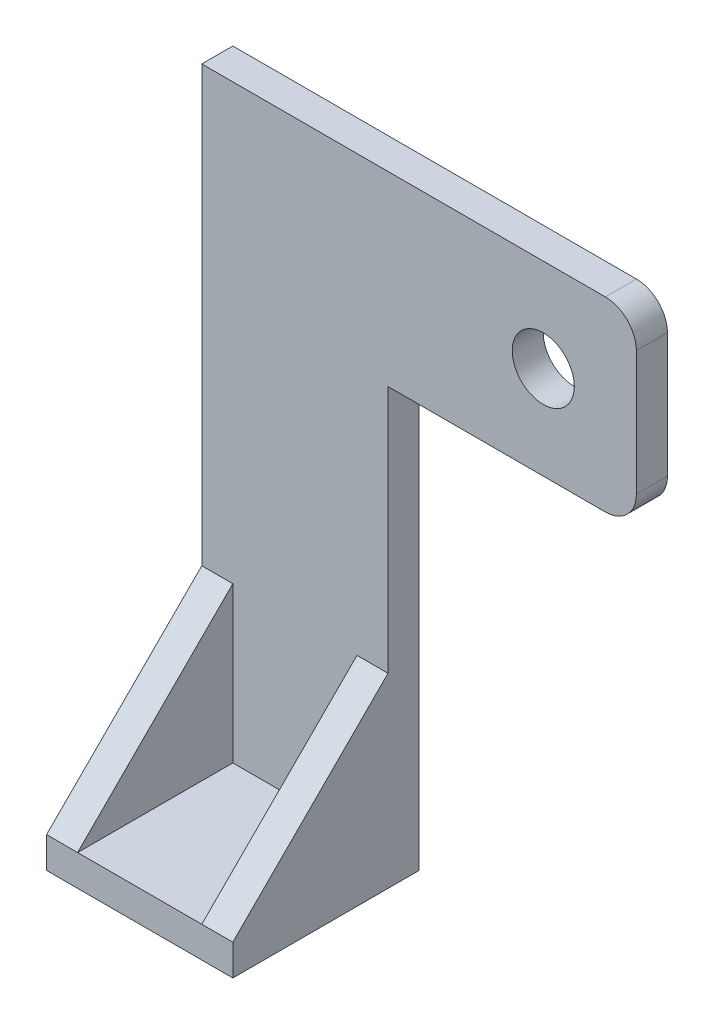
ISO-10303-21;
HEADER;
FILE_DESCRIPTION(('STEP AP214'),'2;1');
FILE_NAME('part.step','',(''),(''),'','','');
FILE_SCHEMA(('AUTOMOTIVE_DESIGN { 1 0 10303 214 1 1 1 1 }'));
ENDSEC;
DATA;
#1=APPLICATION_CONTEXT('core data for automotive mechanical design processes');
#2=APPLICATION_PROTOCOL_DEFINITION('international standard','automotive_design',2000,#1);
#3=PRODUCT_CONTEXT('',#1,'mechanical');
#4=PRODUCT('Part','Part','',(#3));
#5=PRODUCT_RELATED_PRODUCT_CATEGORY('part','',(#4));
#6=PRODUCT_DEFINITION_FORMATION('','',#4);
#7=PRODUCT_DEFINITION_CONTEXT('part definition',#1,'design');
#8=PRODUCT_DEFINITION('design','',#6,#7);
#9=PRODUCT_DEFINITION_SHAPE('','',#8);
#10=(LENGTH_UNIT() NAMED_UNIT(*) SI_UNIT(.MILLI.,.METRE.));
#11=(NAMED_UNIT(*) PLANE_ANGLE_UNIT() SI_UNIT($,.RADIAN.));
#12=(NAMED_UNIT(*) SI_UNIT($,.STERADIAN.) SOLID_ANGLE_UNIT());
#13=UNCERTAINTY_MEASURE_WITH_UNIT(LENGTH_MEASURE(1.E-05),#10,'distance_accuracy_value','');
#14=(GEOMETRIC_REPRESENTATION_CONTEXT(3) GLOBAL_UNCERTAINTY_ASSIGNED_CONTEXT((#13)) GLOBAL_UNIT_ASSIGNED_CONTEXT((#10,
#11,#12)) REPRESENTATION_CONTEXT('',''));
#15=CARTESIAN_POINT('',(0.,0.,0.));
#16=DIRECTION('',(0.,0.,1.));
#17=DIRECTION('',(1.,0.,0.));
#18=AXIS2_PLACEMENT_3D('',#15,#16,#17);
#19=CARTESIAN_POINT('',(0.,-95.,0.));
#20=DIRECTION('',(0.,1.,0.));
#21=DIRECTION('',(0.,0.,1.));
#22=AXIS2_PLACEMENT_3D('',#19,#20,#21);
#23=PLANE('',#22);
#24=DIRECTION('',(-1.,0.,0.));
#25=VECTOR('',#24,1.);
#26=CARTESIAN_POINT('',(40.,-95.,30.));
#27=LINE('',#26,#25);
#28=CARTESIAN_POINT('',(65.,-95.,30.));
#29=VERTEX_POINT('',#28);
#30=CARTESIAN_POINT('',(45.,-95.,30.));
#31=VERTEX_POINT('',#30);
#32=EDGE_CURVE('E214',#29,#31,#27,.T.);
#33=ORIENTED_EDGE('',*,*,#32,.F.);
#34=DIRECTION('',(0.,0.,1.));
#35=VECTOR('',#34,1.);
#36=CARTESIAN_POINT('',(65.,-95.,30.));
#37=LINE('',#36,#35);
#38=CARTESIAN_POINT('',(65.,-95.,5.));
#39=VERTEX_POINT('',#38);
#40=EDGE_CURVE('E193',#39,#29,#37,.T.);
#41=ORIENTED_EDGE('',*,*,#40,.F.);
#42=DIRECTION('',(-1.,0.,0.));
#43=VECTOR('',#42,1.);
#44=CARTESIAN_POINT('',(70.,-95.,5.));
#45=LINE('',#44,#43);
#46=CARTESIAN_POINT('',(45.,-95.,5.));
#47=VERTEX_POINT('',#46);
#48=EDGE_CURVE('E141',#39,#47,#45,.T.);
#49=ORIENTED_EDGE('',*,*,#48,.T.);
#50=DIRECTION('',(0.,0.,1.));
#51=VECTOR('',#50,1.);
#52=CARTESIAN_POINT('',(45.,-95.,30.));
#53=LINE('',#52,#51);
#54=EDGE_CURVE('E204',#47,#31,#53,.T.);
#55=ORIENTED_EDGE('',*,*,#54,.T.);
#56=EDGE_LOOP('',(#33,#41,#49,#55));
#57=FACE_BOUND('',#56,.T.);
#58=ADVANCED_FACE('F36',(#57),#23,.T.);
#59=CARTESIAN_POINT('',(5.,-5.,5.));
#60=DIRECTION('',(0.,0.,1.));
#61=DIRECTION('',(1.,0.,0.));
#62=AXIS2_PLACEMENT_3D('',#59,#60,#61);
#63=PLANE('',#62);
#64=DIRECTION('',(1.,0.,0.));
#65=VECTOR('',#64,1.);
#66=CARTESIAN_POINT('',(5.,0.,5.));
#67=LINE('',#66,#65);
#68=CARTESIAN_POINT('',(40.,0.,5.));
#69=VERTEX_POINT('',#68);
#70=CARTESIAN_POINT('',(105.,0.,5.));
#71=VERTEX_POINT('',#70);
#72=EDGE_CURVE('E11',#69,#71,#67,.T.);
#73=ORIENTED_EDGE('',*,*,#72,.F.);
#74=DIRECTION('',(0.,-1.,0.));
#75=VECTOR('',#74,1.);
#76=CARTESIAN_POINT('',(40.,-30.,5.));
#77=LINE('',#76,#75);
#78=CARTESIAN_POINT('',(40.,-70.,5.));
#79=VERTEX_POINT('',#78);
#80=EDGE_CURVE('E132',#69,#79,#77,.T.);
#81=ORIENTED_EDGE('',*,*,#80,.T.);
#82=DIRECTION('',(-1.,0.,0.));
#83=VECTOR('',#82,1.);
#84=CARTESIAN_POINT('',(45.,-70.,5.));
#85=LINE('',#84,#83);
#86=CARTESIAN_POINT('',(45.,-70.,5.));
#87=VERTEX_POINT('',#86);
#88=EDGE_CURVE('E212',#87,#79,#85,.T.);
#89=ORIENTED_EDGE('',*,*,#88,.F.);
#90=DIRECTION('',(0.,-1.,0.));
#91=VECTOR('',#90,1.);
#92=CARTESIAN_POINT('',(45.,-95.,5.));
#93=LINE('',#92,#91);
#94=EDGE_CURVE('E201',#87,#47,#93,.T.);
#95=ORIENTED_EDGE('',*,*,#94,.T.);
#96=ORIENTED_EDGE('',*,*,#48,.F.);
#97=DIRECTION('',(0.,-1.,0.));
#98=VECTOR('',#97,1.);
#99=CARTESIAN_POINT('',(65.,-95.,5.));
#100=LINE('',#99,#98);
#101=CARTESIAN_POINT('',(65.,-70.,5.));
#102=VERTEX_POINT('',#101);
#103=EDGE_CURVE('E189',#102,#39,#100,.T.);
#104=ORIENTED_EDGE('',*,*,#103,.F.);
#105=DIRECTION('',(1.,0.,0.));
#106=VECTOR('',#105,1.);
#107=CARTESIAN_POINT('',(65.,-70.,5.));
#108=LINE('',#107,#106);
#109=CARTESIAN_POINT('',(70.,-70.,5.));
#110=VERTEX_POINT('',#109);
#111=EDGE_CURVE('E196',#102,#110,#108,.T.);
#112=ORIENTED_EDGE('',*,*,#111,.T.);
#113=DIRECTION('',(0.,-1.,0.));
#114=VECTOR('',#113,1.);
#115=CARTESIAN_POINT('',(70.,-30.,5.));
#116=LINE('',#115,#114);
#117=CARTESIAN_POINT('',(70.,-30.,5.));
#118=VERTEX_POINT('',#117);
#119=EDGE_CURVE('E45',#118,#110,#116,.T.);
#120=ORIENTED_EDGE('',*,*,#119,.F.);
#121=DIRECTION('',(-1.,0.,0.));
#122=VECTOR('',#121,1.);
#123=CARTESIAN_POINT('',(105.,-30.,5.));
#124=LINE('',#123,#122);
#125=CARTESIAN_POINT('',(105.,-30.,5.));
#126=VERTEX_POINT('',#125);
#127=EDGE_CURVE('E158',#126,#118,#124,.T.);
#128=ORIENTED_EDGE('',*,*,#127,.F.);
#129=CARTESIAN_POINT('',(105.,-25.,5.));
#130=DIRECTION('',(0.,0.,1.));
#131=DIRECTION('',(1.,0.,0.));
#132=AXIS2_PLACEMENT_3D('',#129,#130,#131);
#133=CIRCLE('',#132,5.);
#134=CARTESIAN_POINT('',(110.,-25.,5.));
#135=VERTEX_POINT('',#134);
#136=EDGE_CURVE('E161',#126,#135,#133,.T.);
#137=ORIENTED_EDGE('',*,*,#136,.T.);
#138=DIRECTION('',(0.,-1.,0.));
#139=VECTOR('',#138,1.);
#140=CARTESIAN_POINT('',(110.,-5.00000000000001,5.));
#141=LINE('',#140,#139);
#142=CARTESIAN_POINT('',(110.,-5.00000000000001,5.));
#143=VERTEX_POINT('',#142);
#144=EDGE_CURVE('E156',#143,#135,#141,.T.);
#145=ORIENTED_EDGE('',*,*,#144,.F.);
#146=CARTESIAN_POINT('',(105.,-5.00000000000001,5.));
#147=DIRECTION('',(0.,0.,-1.));
#148=DIRECTION('',(-1.,0.,0.));
#149=AXIS2_PLACEMENT_3D('',#146,#147,#148);
#150=CIRCLE('',#149,5.);
#151=EDGE_CURVE('E154',#71,#143,#150,.T.);
#152=ORIENTED_EDGE('',*,*,#151,.F.);
#153=EDGE_LOOP('',(#73,#81,#89,#95,#96,#104,#112,#120,#128,#137,#145,#152));
#154=FACE_BOUND('',#153,.T.);
#155=CARTESIAN_POINT('',(95.,-15.,5.));
#156=DIRECTION('',(0.,0.,1.));
#157=DIRECTION('',(1.,0.,0.));
#158=AXIS2_PLACEMENT_3D('',#155,#156,#157);
#159=CIRCLE('',#158,5.);
#160=CARTESIAN_POINT('',(100.,-15.,5.));
#161=VERTEX_POINT('',#160);
#162=EDGE_CURVE('E147',#161,#161,#159,.T.);
#163=ORIENTED_EDGE('',*,*,#162,.F.);
#164=EDGE_LOOP('',(#163));
#165=FACE_BOUND('',#164,.T.);
#166=ADVANCED_FACE('F150',(#154,#165),#63,.T.);
#167=CARTESIAN_POINT('',(40.,-30.,5.));
#168=DIRECTION('',(1.,0.,0.));
#169=DIRECTION('',(0.,1.,0.));
#170=AXIS2_PLACEMENT_3D('',#167,#168,#169);
#171=PLANE('',#170);
#172=DIRECTION('',(0.,-1.,0.));
#173=VECTOR('',#172,1.);
#174=CARTESIAN_POINT('',(40.,-30.,0.));
#175=LINE('',#174,#173);
#176=CARTESIAN_POINT('',(40.,0.,0.));
#177=VERTEX_POINT('',#176);
#178=CARTESIAN_POINT('',(40.,-100.,0.));
#179=VERTEX_POINT('',#178);
#180=EDGE_CURVE('E53',#177,#179,#175,.T.);
#181=ORIENTED_EDGE('',*,*,#180,.T.);
#182=DIRECTION('',(0.,0.,-1.));
#183=VECTOR('',#182,1.);
#184=CARTESIAN_POINT('',(40.,-100.,0.));
#185=LINE('',#184,#183);
#186=CARTESIAN_POINT('',(40.,-100.,30.));
#187=VERTEX_POINT('',#186);
#188=EDGE_CURVE('E217',#187,#179,#185,.T.);
#189=ORIENTED_EDGE('',*,*,#188,.F.);
#190=DIRECTION('',(0.,1.,0.));
#191=VECTOR('',#190,1.);
#192=CARTESIAN_POINT('',(40.,-100.,30.));
#193=LINE('',#192,#191);
#194=CARTESIAN_POINT('',(40.,-95.,30.));
#195=VERTEX_POINT('',#194);
#196=EDGE_CURVE('E228',#187,#195,#193,.T.);
#197=ORIENTED_EDGE('',*,*,#196,.T.);
#198=DIRECTION('',(0.,0.707106781186547,-0.707106781186548));
#199=VECTOR('',#198,1.);
#200=CARTESIAN_POINT('',(40.,-70.,5.));
#201=LINE('',#200,#199);
#202=EDGE_CURVE('E137',#195,#79,#201,.T.);
#203=ORIENTED_EDGE('',*,*,#202,.T.);
#204=ORIENTED_EDGE('',*,*,#80,.F.);
#205=DIRECTION('',(0.,0.,-1.));
#206=VECTOR('',#205,1.);
#207=CARTESIAN_POINT('',(40.,0.,5.));
#208=LINE('',#207,#206);
#209=EDGE_CURVE('E134',#69,#177,#208,.T.);
#210=ORIENTED_EDGE('',*,*,#209,.T.);
#211=EDGE_LOOP('',(#181,#189,#197,#203,#204,#210));
#212=FACE_BOUND('',#211,.T.);
#213=ADVANCED_FACE('F38',(#212),#171,.F.);
#214=CARTESIAN_POINT('',(70.,0.,5.));
#215=DIRECTION('',(1.,0.,0.));
#216=DIRECTION('',(0.,0.,-1.));
#217=AXIS2_PLACEMENT_3D('',#214,#215,#216);
#218=PLANE('',#217);
#219=DIRECTION('',(0.,0.,-1.));
#220=VECTOR('',#219,1.);
#221=CARTESIAN_POINT('',(70.,-30.,5.));
#222=LINE('',#221,#220);
#223=CARTESIAN_POINT('',(70.,-30.,0.));
#224=VERTEX_POINT('',#223);
#225=EDGE_CURVE('E184',#118,#224,#222,.T.);
#226=ORIENTED_EDGE('',*,*,#225,.F.);
#227=ORIENTED_EDGE('',*,*,#119,.T.);
#228=DIRECTION('',(0.,0.707106781186547,-0.707106781186548));
#229=VECTOR('',#228,1.);
#230=CARTESIAN_POINT('',(70.,-70.,5.));
#231=LINE('',#230,#229);
#232=CARTESIAN_POINT('',(70.,-95.,30.));
#233=VERTEX_POINT('',#232);
#234=EDGE_CURVE('E188',#233,#110,#231,.T.);
#235=ORIENTED_EDGE('',*,*,#234,.F.);
#236=DIRECTION('',(0.,1.,0.));
#237=VECTOR('',#236,1.);
#238=CARTESIAN_POINT('',(70.,-100.,30.));
#239=LINE('',#238,#237);
#240=CARTESIAN_POINT('',(70.,-100.,30.));
#241=VERTEX_POINT('',#240);
#242=EDGE_CURVE('E232',#241,#233,#239,.T.);
#243=ORIENTED_EDGE('',*,*,#242,.F.);
#244=DIRECTION('',(0.,0.,1.));
#245=VECTOR('',#244,1.);
#246=CARTESIAN_POINT('',(70.,-100.,0.));
#247=LINE('',#246,#245);
#248=CARTESIAN_POINT('',(70.,-100.,0.));
#249=VERTEX_POINT('',#248);
#250=EDGE_CURVE('E224',#249,#241,#247,.T.);
#251=ORIENTED_EDGE('',*,*,#250,.F.);
#252=DIRECTION('',(0.,-1.,0.));
#253=VECTOR('',#252,1.);
#254=CARTESIAN_POINT('',(70.,0.,0.));
#255=LINE('',#254,#253);
#256=EDGE_CURVE('E237',#224,#249,#255,.T.);
#257=ORIENTED_EDGE('',*,*,#256,.F.);
#258=EDGE_LOOP('',(#226,#227,#235,#243,#251,#257));
#259=FACE_BOUND('',#258,.T.);
#260=ADVANCED_FACE('F255',(#259),#218,.T.);
#261=CARTESIAN_POINT('',(5.,0.,5.));
#262=DIRECTION('',(0.,1.,0.));
#263=DIRECTION('',(0.,0.,1.));
#264=AXIS2_PLACEMENT_3D('',#261,#262,#263);
#265=PLANE('',#264);
#266=ORIENTED_EDGE('',*,*,#209,.F.);
#267=ORIENTED_EDGE('',*,*,#72,.T.);
#268=DIRECTION('',(0.,0.,-1.));
#269=VECTOR('',#268,1.);
#270=CARTESIAN_POINT('',(105.,0.,5.));
#271=LINE('',#270,#269);
#272=CARTESIAN_POINT('',(105.,0.,0.));
#273=VERTEX_POINT('',#272);
#274=EDGE_CURVE('E186',#71,#273,#271,.T.);
#275=ORIENTED_EDGE('',*,*,#274,.T.);
#276=DIRECTION('',(1.,0.,0.));
#277=VECTOR('',#276,1.);
#278=CARTESIAN_POINT('',(5.,0.,0.));
#279=LINE('',#278,#277);
#280=EDGE_CURVE('E40',#177,#273,#279,.T.);
#281=ORIENTED_EDGE('',*,*,#280,.F.);
#282=EDGE_LOOP('',(#266,#267,#275,#281));
#283=FACE_BOUND('',#282,.T.);
#284=ADVANCED_FACE('F144',(#283),#265,.T.);
#285=CARTESIAN_POINT('',(5.,-5.,0.));
#286=DIRECTION('',(0.,0.,1.));
#287=DIRECTION('',(1.,0.,0.));
#288=AXIS2_PLACEMENT_3D('',#285,#286,#287);
#289=PLANE('',#288);
#290=CARTESIAN_POINT('',(95.,-15.,0.));
#291=DIRECTION('',(0.,0.,1.));
#292=DIRECTION('',(1.,0.,0.));
#293=AXIS2_PLACEMENT_3D('',#290,#291,#292);
#294=CIRCLE('',#293,5.);
#295=CARTESIAN_POINT('',(100.,-15.,0.));
#296=VERTEX_POINT('',#295);
#297=EDGE_CURVE('E175',#296,#296,#294,.T.);
#298=ORIENTED_EDGE('',*,*,#297,.T.);
#299=EDGE_LOOP('',(#298));
#300=FACE_BOUND('',#299,.T.);
#301=ORIENTED_EDGE('',*,*,#180,.F.);
#302=ORIENTED_EDGE('',*,*,#280,.T.);
#303=CARTESIAN_POINT('',(105.,-5.00000000000001,0.));
#304=DIRECTION('',(0.,0.,-1.));
#305=DIRECTION('',(-1.,0.,0.));
#306=AXIS2_PLACEMENT_3D('',#303,#304,#305);
#307=CIRCLE('',#306,5.);
#308=CARTESIAN_POINT('',(110.,-5.00000000000001,0.));
#309=VERTEX_POINT('',#308);
#310=EDGE_CURVE('E172',#273,#309,#307,.T.);
#311=ORIENTED_EDGE('',*,*,#310,.T.);
#312=DIRECTION('',(0.,-1.,0.));
#313=VECTOR('',#312,1.);
#314=CARTESIAN_POINT('',(110.,-5.00000000000001,0.));
#315=LINE('',#314,#313);
#316=CARTESIAN_POINT('',(110.,-25.,0.));
#317=VERTEX_POINT('',#316);
#318=EDGE_CURVE('E159',#309,#317,#315,.T.);
#319=ORIENTED_EDGE('',*,*,#318,.T.);
#320=CARTESIAN_POINT('',(105.,-25.,0.));
#321=DIRECTION('',(0.,0.,1.));
#322=DIRECTION('',(1.,0.,0.));
#323=AXIS2_PLACEMENT_3D('',#320,#321,#322);
#324=CIRCLE('',#323,5.);
#325=CARTESIAN_POINT('',(105.,-30.,0.));
#326=VERTEX_POINT('',#325);
#327=EDGE_CURVE('E164',#326,#317,#324,.T.);
#328=ORIENTED_EDGE('',*,*,#327,.F.);
#329=DIRECTION('',(-1.,0.,0.));
#330=VECTOR('',#329,1.);
#331=CARTESIAN_POINT('',(105.,-30.,0.));
#332=LINE('',#331,#330);
#333=EDGE_CURVE('E60',#326,#224,#332,.T.);
#334=ORIENTED_EDGE('',*,*,#333,.T.);
#335=ORIENTED_EDGE('',*,*,#256,.T.);
#336=DIRECTION('',(1.,0.,0.));
#337=VECTOR('',#336,1.);
#338=CARTESIAN_POINT('',(40.,-100.,0.));
#339=LINE('',#338,#337);
#340=EDGE_CURVE('E220',#179,#249,#339,.T.);
#341=ORIENTED_EDGE('',*,*,#340,.F.);
#342=EDGE_LOOP('',(#301,#302,#311,#319,#328,#334,#335,#341));
#343=FACE_BOUND('',#342,.T.);
#344=ADVANCED_FACE('F239',(#300,#343),#289,.F.);
#345=CARTESIAN_POINT('',(40.,-100.,30.));
#346=DIRECTION('',(0.,0.,-1.));
#347=DIRECTION('',(-1.,0.,0.));
#348=AXIS2_PLACEMENT_3D('',#345,#346,#347);
#349=PLANE('',#348);
#350=EDGE_CURVE('E221',#233,#29,#27,.T.);
#351=ORIENTED_EDGE('',*,*,#350,.T.);
#352=ORIENTED_EDGE('',*,*,#32,.T.);
#353=DIRECTION('',(-1.,0.,0.));
#354=VECTOR('',#353,1.);
#355=CARTESIAN_POINT('',(45.,-95.,30.));
#356=LINE('',#355,#354);
#357=EDGE_CURVE('E210',#31,#195,#356,.T.);
#358=ORIENTED_EDGE('',*,*,#357,.T.);
#359=ORIENTED_EDGE('',*,*,#196,.F.);
#360=DIRECTION('',(-1.,0.,0.));
#361=VECTOR('',#360,1.);
#362=CARTESIAN_POINT('',(40.,-100.,30.));
#363=LINE('',#362,#361);
#364=EDGE_CURVE('E226',#241,#187,#363,.T.);
#365=ORIENTED_EDGE('',*,*,#364,.F.);
#366=ORIENTED_EDGE('',*,*,#242,.T.);
#367=EDGE_LOOP('',(#351,#352,#358,#359,#365,#366));
#368=FACE_BOUND('',#367,.T.);
#369=ADVANCED_FACE('F264',(#368),#349,.F.);
#370=CARTESIAN_POINT('',(0.,-100.,0.));
#371=DIRECTION('',(0.,1.,0.));
#372=DIRECTION('',(0.,0.,1.));
#373=AXIS2_PLACEMENT_3D('',#370,#371,#372);
#374=PLANE('',#373);
#375=ORIENTED_EDGE('',*,*,#188,.T.);
#376=ORIENTED_EDGE('',*,*,#340,.T.);
#377=ORIENTED_EDGE('',*,*,#250,.T.);
#378=ORIENTED_EDGE('',*,*,#364,.T.);
#379=EDGE_LOOP('',(#375,#376,#377,#378));
#380=FACE_BOUND('',#379,.T.);
#381=ADVANCED_FACE('F260',(#380),#374,.F.);
#382=CARTESIAN_POINT('',(45.,-70.,5.));
#383=DIRECTION('',(0.,0.707106781186548,0.707106781186547));
#384=DIRECTION('',(0.,-0.707106781186547,0.707106781186548));
#385=AXIS2_PLACEMENT_3D('',#382,#383,#384);
#386=PLANE('',#385);
#387=ORIENTED_EDGE('',*,*,#202,.F.);
#388=ORIENTED_EDGE('',*,*,#357,.F.);
#389=DIRECTION('',(0.,0.707106781186547,-0.707106781186548));
#390=VECTOR('',#389,1.);
#391=CARTESIAN_POINT('',(45.,-70.,5.));
#392=LINE('',#391,#390);
#393=EDGE_CURVE('E207',#31,#87,#392,.T.);
#394=ORIENTED_EDGE('',*,*,#393,.T.);
#395=ORIENTED_EDGE('',*,*,#88,.T.);
#396=EDGE_LOOP('',(#387,#388,#394,#395));
#397=FACE_BOUND('',#396,.T.);
#398=ADVANCED_FACE('F269',(#397),#386,.T.);
#399=CARTESIAN_POINT('',(45.,0.,0.));
#400=DIRECTION('',(-1.,0.,0.));
#401=DIRECTION('',(0.,0.,1.));
#402=AXIS2_PLACEMENT_3D('',#399,#400,#401);
#403=PLANE('',#402);
#404=ORIENTED_EDGE('',*,*,#94,.F.);
#405=ORIENTED_EDGE('',*,*,#393,.F.);
#406=ORIENTED_EDGE('',*,*,#54,.F.);
#407=EDGE_LOOP('',(#404,#405,#406));
#408=FACE_BOUND('',#407,.T.);
#409=ADVANCED_FACE('F272',(#408),#403,.F.);
#410=CARTESIAN_POINT('',(65.,-70.,5.));
#411=DIRECTION('',(0.,-0.707106781186548,-0.707106781186547));
#412=DIRECTION('',(0.,0.707106781186547,-0.707106781186548));
#413=AXIS2_PLACEMENT_3D('',#410,#411,#412);
#414=PLANE('',#413);
#415=ORIENTED_EDGE('',*,*,#234,.T.);
#416=ORIENTED_EDGE('',*,*,#111,.F.);
#417=DIRECTION('',(0.,0.707106781186547,-0.707106781186548));
#418=VECTOR('',#417,1.);
#419=CARTESIAN_POINT('',(65.,-70.,5.));
#420=LINE('',#419,#418);
#421=EDGE_CURVE('E191',#29,#102,#420,.T.);
#422=ORIENTED_EDGE('',*,*,#421,.F.);
#423=ORIENTED_EDGE('',*,*,#350,.F.);
#424=EDGE_LOOP('',(#415,#416,#422,#423));
#425=FACE_BOUND('',#424,.T.);
#426=ADVANCED_FACE('F281',(#425),#414,.F.);
#427=CARTESIAN_POINT('',(65.,0.,0.));
#428=DIRECTION('',(1.,0.,0.));
#429=DIRECTION('',(0.,0.,1.));
#430=AXIS2_PLACEMENT_3D('',#427,#428,#429);
#431=PLANE('',#430);
#432=ORIENTED_EDGE('',*,*,#103,.T.);
#433=ORIENTED_EDGE('',*,*,#40,.T.);
#434=ORIENTED_EDGE('',*,*,#421,.T.);
#435=EDGE_LOOP('',(#432,#433,#434));
#436=FACE_BOUND('',#435,.T.);
#437=ADVANCED_FACE('F279',(#436),#431,.F.);
#438=CARTESIAN_POINT('',(105.,-5.00000000000001,5.));
#439=DIRECTION('',(0.,0.,-1.));
#440=DIRECTION('',(-1.,0.,0.));
#441=AXIS2_PLACEMENT_3D('',#438,#439,#440);
#442=CYLINDRICAL_SURFACE('',#441,5.);
#443=ORIENTED_EDGE('',*,*,#310,.F.);
#444=ORIENTED_EDGE('',*,*,#274,.F.);
#445=ORIENTED_EDGE('',*,*,#151,.T.);
#446=DIRECTION('',(0.,0.,-1.));
#447=VECTOR('',#446,1.);
#448=CARTESIAN_POINT('',(110.,-5.00000000000001,5.));
#449=LINE('',#448,#447);
#450=EDGE_CURVE('E171',#143,#309,#449,.T.);
#451=ORIENTED_EDGE('',*,*,#450,.T.);
#452=EDGE_LOOP('',(#443,#444,#445,#451));
#453=FACE_BOUND('',#452,.T.);
#454=ADVANCED_FACE('F242',(#453),#442,.T.);
#455=CARTESIAN_POINT('',(105.,-30.,5.));
#456=DIRECTION('',(0.,-1.,0.));
#457=DIRECTION('',(1.,0.,0.));
#458=AXIS2_PLACEMENT_3D('',#455,#456,#457);
#459=PLANE('',#458);
#460=ORIENTED_EDGE('',*,*,#333,.F.);
#461=DIRECTION('',(0.,0.,-1.));
#462=VECTOR('',#461,1.);
#463=CARTESIAN_POINT('',(105.,-30.,5.));
#464=LINE('',#463,#462);
#465=EDGE_CURVE('E182',#126,#326,#464,.T.);
#466=ORIENTED_EDGE('',*,*,#465,.F.);
#467=ORIENTED_EDGE('',*,*,#127,.T.);
#468=ORIENTED_EDGE('',*,*,#225,.T.);
#469=EDGE_LOOP('',(#460,#466,#467,#468));
#470=FACE_BOUND('',#469,.T.);
#471=ADVANCED_FACE('F248',(#470),#459,.T.);
#472=CARTESIAN_POINT('',(105.,-25.,5.));
#473=DIRECTION('',(0.,0.,-1.));
#474=DIRECTION('',(-1.,0.,0.));
#475=AXIS2_PLACEMENT_3D('',#472,#473,#474);
#476=CYLINDRICAL_SURFACE('',#475,5.);
#477=ORIENTED_EDGE('',*,*,#327,.T.);
#478=DIRECTION('',(0.,0.,-1.));
#479=VECTOR('',#478,1.);
#480=CARTESIAN_POINT('',(110.,-25.,5.));
#481=LINE('',#480,#479);
#482=EDGE_CURVE('E180',#135,#317,#481,.T.);
#483=ORIENTED_EDGE('',*,*,#482,.F.);
#484=ORIENTED_EDGE('',*,*,#136,.F.);
#485=ORIENTED_EDGE('',*,*,#465,.T.);
#486=EDGE_LOOP('',(#477,#483,#484,#485));
#487=FACE_BOUND('',#486,.T.);
#488=ADVANCED_FACE('F282',(#487),#476,.T.);
#489=CARTESIAN_POINT('',(110.,-5.00000000000001,5.));
#490=DIRECTION('',(1.,0.,0.));
#491=DIRECTION('',(0.,1.,0.));
#492=AXIS2_PLACEMENT_3D('',#489,#490,#491);
#493=PLANE('',#492);
#494=ORIENTED_EDGE('',*,*,#318,.F.);
#495=ORIENTED_EDGE('',*,*,#450,.F.);
#496=ORIENTED_EDGE('',*,*,#144,.T.);
#497=ORIENTED_EDGE('',*,*,#482,.T.);
#498=EDGE_LOOP('',(#494,#495,#496,#497));
#499=FACE_BOUND('',#498,.T.);
#500=ADVANCED_FACE('F244',(#499),#493,.T.);
#501=CARTESIAN_POINT('',(95.,-15.,0.));
#502=DIRECTION('',(0.,0.,1.));
#503=DIRECTION('',(1.,0.,0.));
#504=AXIS2_PLACEMENT_3D('',#501,#502,#503);
#505=CYLINDRICAL_SURFACE('',#504,5.);
#506=ORIENTED_EDGE('',*,*,#297,.F.);
#507=EDGE_LOOP('',(#506));
#508=FACE_BOUND('',#507,.T.);
#509=ORIENTED_EDGE('',*,*,#162,.T.);
#510=EDGE_LOOP('',(#509));
#511=FACE_BOUND('',#510,.T.);
#512=ADVANCED_FACE('F289',(#508,#511),#505,.F.);
#513=CLOSED_SHELL('',(#58,#166,#213,#260,#284,#344,#369,#381,#398,#409,#426,#437,#454,#471,#488,
#500,#512));
#514=MANIFOLD_SOLID_BREP('B2',#513);
#515=ADVANCED_BREP_SHAPE_REPRESENTATION('',(#18,#514),#14);
#516=SHAPE_DEFINITION_REPRESENTATION(#9,#515);
ENDSEC;
END-ISO-10303-21;
